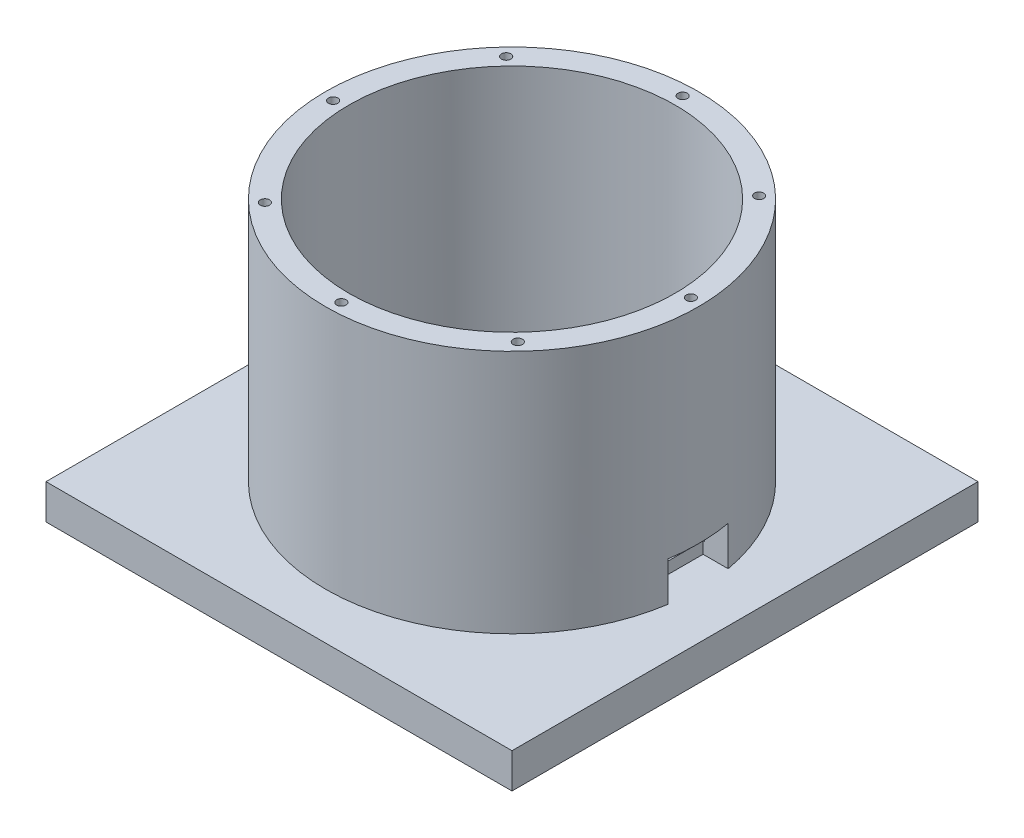
ISO-10303-21;
HEADER;
FILE_DESCRIPTION(('STEP AP214'),'2;1');
FILE_NAME('part.step','',(''),(''),'','','');
FILE_SCHEMA(('AUTOMOTIVE_DESIGN { 1 0 10303 214 1 1 1 1 }'));
ENDSEC;
DATA;
#1=APPLICATION_CONTEXT('core data for automotive mechanical design processes');
#2=APPLICATION_PROTOCOL_DEFINITION('international standard','automotive_design',2000,#1);
#3=PRODUCT_CONTEXT('',#1,'mechanical');
#4=PRODUCT('Part','Part','',(#3));
#5=PRODUCT_RELATED_PRODUCT_CATEGORY('part','',(#4));
#6=PRODUCT_DEFINITION_FORMATION('','',#4);
#7=PRODUCT_DEFINITION_CONTEXT('part definition',#1,'design');
#8=PRODUCT_DEFINITION('design','',#6,#7);
#9=PRODUCT_DEFINITION_SHAPE('','',#8);
#10=(LENGTH_UNIT() NAMED_UNIT(*) SI_UNIT(.MILLI.,.METRE.));
#11=(NAMED_UNIT(*) PLANE_ANGLE_UNIT() SI_UNIT($,.RADIAN.));
#12=(NAMED_UNIT(*) SI_UNIT($,.STERADIAN.) SOLID_ANGLE_UNIT());
#13=UNCERTAINTY_MEASURE_WITH_UNIT(LENGTH_MEASURE(1.E-05),#10,'distance_accuracy_value','');
#14=(GEOMETRIC_REPRESENTATION_CONTEXT(3) GLOBAL_UNCERTAINTY_ASSIGNED_CONTEXT((#13)) GLOBAL_UNIT_ASSIGNED_CONTEXT((#10,
#11,#12)) REPRESENTATION_CONTEXT('',''));
#15=CARTESIAN_POINT('',(0.,0.,0.));
#16=DIRECTION('',(0.,0.,1.));
#17=DIRECTION('',(1.,0.,0.));
#18=AXIS2_PLACEMENT_3D('',#15,#16,#17);
#19=CARTESIAN_POINT('',(0.,5.,0.));
#20=DIRECTION('',(0.,-1.,0.));
#21=DIRECTION('',(0.,0.,-1.));
#22=AXIS2_PLACEMENT_3D('',#19,#20,#21);
#23=CYLINDRICAL_SURFACE('',#22,80.);
#24=CARTESIAN_POINT('',(0.,0.,0.));
#25=DIRECTION('',(0.,1.,0.));
#26=DIRECTION('',(0.,0.,1.));
#27=AXIS2_PLACEMENT_3D('',#24,#25,#26);
#28=CIRCLE('',#27,80.);
#29=CARTESIAN_POINT('',(78.7649541216659,0.,-14.0029283441667));
#30=VERTEX_POINT('',#29);
#31=CARTESIAN_POINT('',(79.0659159763174,0.,12.18937778666));
#32=VERTEX_POINT('',#31);
#33=EDGE_CURVE('E244',#30,#32,#28,.T.);
#34=ORIENTED_EDGE('',*,*,#33,.T.);
#35=DIRECTION('',(0.,-1.,0.));
#36=VECTOR('',#35,1.);
#37=CARTESIAN_POINT('',(79.0659159763174,5.,12.18937778666));
#38=LINE('',#37,#36);
#39=CARTESIAN_POINT('',(79.0659159763174,16.9083896397272,12.18937778666));
#40=VERTEX_POINT('',#39);
#41=EDGE_CURVE('E158',#32,#40,#38,.F.);
#42=ORIENTED_EDGE('',*,*,#41,.T.);
#43=CARTESIAN_POINT('',(0.,16.9083896397272,0.));
#44=DIRECTION('',(0.,1.,0.));
#45=DIRECTION('',(0.,0.,1.));
#46=AXIS2_PLACEMENT_3D('',#43,#44,#45);
#47=CIRCLE('',#46,80.);
#48=CARTESIAN_POINT('',(78.7649541216659,16.9083896397272,-14.0029283441667));
#49=VERTEX_POINT('',#48);
#50=EDGE_CURVE('E198',#40,#49,#47,.T.);
#51=ORIENTED_EDGE('',*,*,#50,.T.);
#52=DIRECTION('',(0.,-1.,0.));
#53=VECTOR('',#52,1.);
#54=CARTESIAN_POINT('',(78.7649541216659,5.,-14.0029283441667));
#55=LINE('',#54,#53);
#56=EDGE_CURVE('E186',#49,#30,#55,.T.);
#57=ORIENTED_EDGE('',*,*,#56,.T.);
#58=EDGE_LOOP('',(#34,#42,#51,#57));
#59=FACE_BOUND('',#58,.T.);
#60=CARTESIAN_POINT('',(0.,105.,0.));
#61=DIRECTION('',(0.,1.,0.));
#62=DIRECTION('',(0.,0.,1.));
#63=AXIS2_PLACEMENT_3D('',#60,#61,#62);
#64=CIRCLE('',#63,80.);
#65=CARTESIAN_POINT('',(0.,105.,80.));
#66=VERTEX_POINT('',#65);
#67=EDGE_CURVE('E309',#66,#66,#64,.T.);
#68=ORIENTED_EDGE('',*,*,#67,.F.);
#69=EDGE_LOOP('',(#68));
#70=FACE_BOUND('',#69,.T.);
#71=ADVANCED_FACE('F45',(#59,#70),#23,.T.);
#72=CARTESIAN_POINT('',(0.,105.,0.));
#73=DIRECTION('',(0.,1.,0.));
#74=DIRECTION('',(0.,0.,1.));
#75=AXIS2_PLACEMENT_3D('',#72,#73,#74);
#76=PLANE('',#75);
#77=CARTESIAN_POINT('',(-75.,105.,1.76512337573966));
#78=DIRECTION('',(0.,1.,0.));
#79=DIRECTION('',(0.,0.,1.));
#80=AXIS2_PLACEMENT_3D('',#77,#78,#79);
#81=CIRCLE('',#80,2.);
#82=CARTESIAN_POINT('',(-75.,105.,3.76512337573966));
#83=VERTEX_POINT('',#82);
#84=EDGE_CURVE('E511',#83,#83,#81,.T.);
#85=ORIENTED_EDGE('',*,*,#84,.F.);
#86=EDGE_LOOP('',(#85));
#87=FACE_BOUND('',#86,.T.);
#88=CARTESIAN_POINT('',(75.,105.,-1.76512337574017));
#89=DIRECTION('',(0.,1.,0.));
#90=DIRECTION('',(0.,0.,1.));
#91=AXIS2_PLACEMENT_3D('',#88,#89,#90);
#92=CIRCLE('',#91,2.);
#93=CARTESIAN_POINT('',(75.,105.,0.234876624259833));
#94=VERTEX_POINT('',#93);
#95=EDGE_CURVE('E531',#94,#94,#92,.T.);
#96=ORIENTED_EDGE('',*,*,#95,.F.);
#97=EDGE_LOOP('',(#96));
#98=FACE_BOUND('',#97,.T.);
#99=CARTESIAN_POINT('',(-51.7848778803746,105.,54.2811392976076));
#100=DIRECTION('',(0.,1.,0.));
#101=DIRECTION('',(0.,0.,1.));
#102=AXIS2_PLACEMENT_3D('',#99,#100,#101);
#103=CIRCLE('',#102,2.00000000000001);
#104=CARTESIAN_POINT('',(-51.7848778803746,105.,56.2811392976076));
#105=VERTEX_POINT('',#104);
#106=EDGE_CURVE('E552',#105,#105,#103,.T.);
#107=ORIENTED_EDGE('',*,*,#106,.F.);
#108=EDGE_LOOP('',(#107));
#109=FACE_BOUND('',#108,.T.);
#110=CARTESIAN_POINT('',(-1.76512337574045,105.,-75.));
#111=DIRECTION('',(0.,1.,0.));
#112=DIRECTION('',(0.,0.,1.));
#113=AXIS2_PLACEMENT_3D('',#110,#111,#112);
#114=CIRCLE('',#113,2.);
#115=CARTESIAN_POINT('',(-1.76512337574045,105.,-73.));
#116=VERTEX_POINT('',#115);
#117=EDGE_CURVE('E543',#116,#116,#114,.T.);
#118=ORIENTED_EDGE('',*,*,#117,.F.);
#119=EDGE_LOOP('',(#118));
#120=FACE_BOUND('',#119,.T.);
#121=CARTESIAN_POINT('',(1.76512337573992,105.,75.));
#122=DIRECTION('',(0.,1.,0.));
#123=DIRECTION('',(0.,0.,1.));
#124=AXIS2_PLACEMENT_3D('',#121,#122,#123);
#125=CIRCLE('',#124,2.);
#126=CARTESIAN_POINT('',(1.76512337573992,105.,77.));
#127=VERTEX_POINT('',#126);
#128=EDGE_CURVE('E503',#127,#127,#125,.T.);
#129=ORIENTED_EDGE('',*,*,#128,.F.);
#130=EDGE_LOOP('',(#129));
#131=FACE_BOUND('',#130,.T.);
#132=CARTESIAN_POINT('',(54.2811392976078,105.,51.7848778803744));
#133=DIRECTION('',(0.,1.,0.));
#134=DIRECTION('',(0.,0.,1.));
#135=AXIS2_PLACEMENT_3D('',#132,#133,#134);
#136=CIRCLE('',#135,2.);
#137=CARTESIAN_POINT('',(54.2811392976078,105.,53.7848778803744));
#138=VERTEX_POINT('',#137);
#139=EDGE_CURVE('E513',#138,#138,#136,.T.);
#140=ORIENTED_EDGE('',*,*,#139,.F.);
#141=EDGE_LOOP('',(#140));
#142=FACE_BOUND('',#141,.T.);
#143=CARTESIAN_POINT('',(51.7848778803742,105.,-54.2811392976079));
#144=DIRECTION('',(0.,1.,0.));
#145=DIRECTION('',(0.,0.,1.));
#146=AXIS2_PLACEMENT_3D('',#143,#144,#145);
#147=CIRCLE('',#146,2.);
#148=CARTESIAN_POINT('',(51.7848778803742,105.,-52.2811392976079));
#149=VERTEX_POINT('',#148);
#150=EDGE_CURVE('E523',#149,#149,#147,.T.);
#151=ORIENTED_EDGE('',*,*,#150,.F.);
#152=EDGE_LOOP('',(#151));
#153=FACE_BOUND('',#152,.T.);
#154=CARTESIAN_POINT('',(-54.2811392976074,105.,-51.7848778803748));
#155=DIRECTION('',(0.,1.,0.));
#156=DIRECTION('',(0.,0.,1.));
#157=AXIS2_PLACEMENT_3D('',#154,#155,#156);
#158=CIRCLE('',#157,2.);
#159=CARTESIAN_POINT('',(-54.2811392976074,105.,-49.7848778803748));
#160=VERTEX_POINT('',#159);
#161=EDGE_CURVE('E547',#160,#160,#158,.T.);
#162=ORIENTED_EDGE('',*,*,#161,.F.);
#163=EDGE_LOOP('',(#162));
#164=FACE_BOUND('',#163,.T.);
#165=ORIENTED_EDGE('',*,*,#67,.T.);
#166=EDGE_LOOP('',(#165));
#167=FACE_BOUND('',#166,.T.);
#168=CARTESIAN_POINT('',(0.,105.,0.));
#169=DIRECTION('',(0.,1.,0.));
#170=DIRECTION('',(0.,0.,1.));
#171=AXIS2_PLACEMENT_3D('',#168,#169,#170);
#172=CIRCLE('',#171,70.);
#173=CARTESIAN_POINT('',(0.,105.,70.));
#174=VERTEX_POINT('',#173);
#175=EDGE_CURVE('E293',#174,#174,#172,.T.);
#176=ORIENTED_EDGE('',*,*,#175,.F.);
#177=EDGE_LOOP('',(#176));
#178=FACE_BOUND('',#177,.T.);
#179=ADVANCED_FACE('F357',(#87,#98,#109,#120,#131,#142,#153,#164,#167,#178),#76,.T.);
#180=CARTESIAN_POINT('',(0.,105.,0.));
#181=DIRECTION('',(0.,-1.,0.));
#182=DIRECTION('',(0.,0.,-1.));
#183=AXIS2_PLACEMENT_3D('',#180,#181,#182);
#184=CYLINDRICAL_SURFACE('',#183,70.);
#185=DIRECTION('',(0.,-1.,0.));
#186=VECTOR('',#185,1.);
#187=CARTESIAN_POINT('',(68.9305380014844,105.,12.18937778666));
#188=LINE('',#187,#186);
#189=CARTESIAN_POINT('',(68.9305380014844,5.,12.18937778666));
#190=VERTEX_POINT('',#189);
#191=CARTESIAN_POINT('',(68.9305380014844,16.9083896397272,12.18937778666));
#192=VERTEX_POINT('',#191);
#193=EDGE_CURVE('E193',#190,#192,#188,.F.);
#194=ORIENTED_EDGE('',*,*,#193,.F.);
#195=CARTESIAN_POINT('',(0.,5.,0.));
#196=DIRECTION('',(0.,1.,0.));
#197=DIRECTION('',(0.,0.,1.));
#198=AXIS2_PLACEMENT_3D('',#195,#196,#197);
#199=CIRCLE('',#198,70.);
#200=CARTESIAN_POINT('',(68.5851149870592,5.,-14.0029283441667));
#201=VERTEX_POINT('',#200);
#202=EDGE_CURVE('E313',#190,#201,#199,.F.);
#203=ORIENTED_EDGE('',*,*,#202,.T.);
#204=DIRECTION('',(0.,-1.,0.));
#205=VECTOR('',#204,1.);
#206=CARTESIAN_POINT('',(68.5851149870592,105.,-14.0029283441667));
#207=LINE('',#206,#205);
#208=CARTESIAN_POINT('',(68.5851149870592,16.9083896397272,-14.0029283441667));
#209=VERTEX_POINT('',#208);
#210=EDGE_CURVE('E183',#209,#201,#207,.T.);
#211=ORIENTED_EDGE('',*,*,#210,.F.);
#212=CARTESIAN_POINT('',(0.,16.9083896397272,0.));
#213=DIRECTION('',(0.,1.,0.));
#214=DIRECTION('',(0.,0.,1.));
#215=AXIS2_PLACEMENT_3D('',#212,#213,#214);
#216=CIRCLE('',#215,70.);
#217=EDGE_CURVE('E11',#192,#209,#216,.T.);
#218=ORIENTED_EDGE('',*,*,#217,.F.);
#219=EDGE_LOOP('',(#194,#203,#211,#218));
#220=FACE_BOUND('',#219,.T.);
#221=ORIENTED_EDGE('',*,*,#175,.T.);
#222=EDGE_LOOP('',(#221));
#223=FACE_BOUND('',#222,.T.);
#224=ADVANCED_FACE('F354',(#220,#223),#184,.F.);
#225=CARTESIAN_POINT('',(0.,5.,0.));
#226=DIRECTION('',(0.,1.,0.));
#227=DIRECTION('',(0.,0.,1.));
#228=AXIS2_PLACEMENT_3D('',#225,#226,#227);
#229=PLANE('',#228);
#230=DIRECTION('',(1.,0.,0.));
#231=VECTOR('',#230,1.);
#232=CARTESIAN_POINT('',(0.,5.,12.18937778666));
#233=LINE('',#232,#231);
#234=CARTESIAN_POINT('',(68.,5.,12.18937778666));
#235=VERTEX_POINT('',#234);
#236=EDGE_CURVE('E190',#235,#190,#233,.T.);
#237=ORIENTED_EDGE('',*,*,#236,.F.);
#238=DIRECTION('',(0.,0.,1.));
#239=VECTOR('',#238,1.);
#240=CARTESIAN_POINT('',(68.,5.,0.));
#241=LINE('',#240,#239);
#242=CARTESIAN_POINT('',(68.,5.,-14.0029283441667));
#243=VERTEX_POINT('',#242);
#244=EDGE_CURVE('E53',#243,#235,#241,.T.);
#245=ORIENTED_EDGE('',*,*,#244,.F.);
#246=DIRECTION('',(-1.,0.,0.));
#247=VECTOR('',#246,1.);
#248=CARTESIAN_POINT('',(0.,5.,-14.0029283441667));
#249=LINE('',#248,#247);
#250=EDGE_CURVE('E174',#201,#243,#249,.T.);
#251=ORIENTED_EDGE('',*,*,#250,.F.);
#252=ORIENTED_EDGE('',*,*,#202,.F.);
#253=EDGE_LOOP('',(#237,#245,#251,#252));
#254=FACE_BOUND('',#253,.T.);
#255=CARTESIAN_POINT('',(0.,5.,0.));
#256=DIRECTION('',(0.,1.,0.));
#257=DIRECTION('',(0.,0.,1.));
#258=AXIS2_PLACEMENT_3D('',#255,#256,#257);
#259=CIRCLE('',#258,16.15);
#260=CARTESIAN_POINT('',(0.,5.,16.15));
#261=VERTEX_POINT('',#260);
#262=EDGE_CURVE('E287',#261,#261,#259,.T.);
#263=ORIENTED_EDGE('',*,*,#262,.F.);
#264=EDGE_LOOP('',(#263));
#265=FACE_BOUND('',#264,.T.);
#266=CARTESIAN_POINT('',(40.,5.,0.));
#267=DIRECTION('',(0.,1.,0.));
#268=DIRECTION('',(0.,0.,1.));
#269=AXIS2_PLACEMENT_3D('',#266,#267,#268);
#270=CIRCLE('',#269,17.65);
#271=CARTESIAN_POINT('',(40.,5.,17.65));
#272=VERTEX_POINT('',#271);
#273=EDGE_CURVE('E297',#272,#272,#270,.T.);
#274=ORIENTED_EDGE('',*,*,#273,.F.);
#275=EDGE_LOOP('',(#274));
#276=FACE_BOUND('',#275,.T.);
#277=ADVANCED_FACE('F335',(#254,#265,#276),#229,.T.);
#278=CARTESIAN_POINT('',(40.,13.,0.));
#279=DIRECTION('',(0.,1.,0.));
#280=DIRECTION('',(0.,0.,1.));
#281=AXIS2_PLACEMENT_3D('',#278,#279,#280);
#282=PLANE('',#281);
#283=DIRECTION('',(-1.,0.,0.));
#284=VECTOR('',#283,1.);
#285=CARTESIAN_POINT('',(50.8117830414942,13.,6.56717956688094));
#286=LINE('',#285,#284);
#287=CARTESIAN_POINT('',(56.3827547297865,13.,6.56717956688094));
#288=VERTEX_POINT('',#287);
#289=CARTESIAN_POINT('',(50.8117830414942,13.,6.56717956688094));
#290=VERTEX_POINT('',#289);
#291=EDGE_CURVE('E250',#288,#290,#286,.T.);
#292=ORIENTED_EDGE('',*,*,#291,.F.);
#293=CARTESIAN_POINT('',(40.,13.,0.));
#294=DIRECTION('',(0.,1.,0.));
#295=DIRECTION('',(0.,0.,1.));
#296=AXIS2_PLACEMENT_3D('',#293,#294,#295);
#297=CIRCLE('',#296,17.65);
#298=CARTESIAN_POINT('',(56.008612694703,13.,-7.43282043311906));
#299=VERTEX_POINT('',#298);
#300=EDGE_CURVE('E282',#288,#299,#297,.T.);
#301=ORIENTED_EDGE('',*,*,#300,.T.);
#302=DIRECTION('',(1.,0.,0.));
#303=VECTOR('',#302,1.);
#304=CARTESIAN_POINT('',(50.2359992384236,13.,-7.43282043311906));
#305=LINE('',#304,#303);
#306=CARTESIAN_POINT('',(50.2359992384236,13.,-7.43282043311906));
#307=VERTEX_POINT('',#306);
#308=EDGE_CURVE('E260',#307,#299,#305,.T.);
#309=ORIENTED_EDGE('',*,*,#308,.F.);
#310=CARTESIAN_POINT('',(40.,13.,0.));
#311=DIRECTION('',(0.,1.,0.));
#312=DIRECTION('',(0.,0.,1.));
#313=AXIS2_PLACEMENT_3D('',#310,#311,#312);
#314=CIRCLE('',#313,12.65);
#315=EDGE_CURVE('E288',#290,#307,#314,.T.);
#316=ORIENTED_EDGE('',*,*,#315,.F.);
#317=EDGE_LOOP('',(#292,#301,#309,#316));
#318=FACE_BOUND('',#317,.T.);
#319=ADVANCED_FACE('F353',(#318),#282,.T.);
#320=CARTESIAN_POINT('',(40.,13.,0.));
#321=DIRECTION('',(0.,-1.,0.));
#322=DIRECTION('',(0.,0.,-1.));
#323=AXIS2_PLACEMENT_3D('',#320,#321,#322);
#324=CYLINDRICAL_SURFACE('',#323,17.65);
#325=ORIENTED_EDGE('',*,*,#300,.F.);
#326=DIRECTION('',(0.,-1.,0.));
#327=VECTOR('',#326,1.);
#328=CARTESIAN_POINT('',(56.3827547297865,63.,6.56717956688094));
#329=LINE('',#328,#327);
#330=CARTESIAN_POINT('',(56.3827547297865,63.,6.56717956688094));
#331=VERTEX_POINT('',#330);
#332=EDGE_CURVE('E270',#331,#288,#329,.T.);
#333=ORIENTED_EDGE('',*,*,#332,.F.);
#334=CARTESIAN_POINT('',(40.,63.,0.));
#335=DIRECTION('',(0.,1.,0.));
#336=DIRECTION('',(0.,0.,1.));
#337=AXIS2_PLACEMENT_3D('',#334,#335,#336);
#338=CIRCLE('',#337,17.65);
#339=CARTESIAN_POINT('',(56.008612694703,63.,-7.43282043311906));
#340=VERTEX_POINT('',#339);
#341=EDGE_CURVE('E253',#340,#331,#338,.T.);
#342=ORIENTED_EDGE('',*,*,#341,.F.);
#343=DIRECTION('',(0.,-1.,0.));
#344=VECTOR('',#343,1.);
#345=CARTESIAN_POINT('',(56.008612694703,63.,-7.43282043311906));
#346=LINE('',#345,#344);
#347=EDGE_CURVE('E274',#340,#299,#346,.T.);
#348=ORIENTED_EDGE('',*,*,#347,.T.);
#349=EDGE_LOOP('',(#325,#333,#342,#348));
#350=FACE_BOUND('',#349,.T.);
#351=ORIENTED_EDGE('',*,*,#273,.T.);
#352=EDGE_LOOP('',(#351));
#353=FACE_BOUND('',#352,.T.);
#354=ADVANCED_FACE('F379',(#350,#353),#324,.T.);
#355=CARTESIAN_POINT('',(40.,13.,0.));
#356=DIRECTION('',(0.,-1.,0.));
#357=DIRECTION('',(0.,0.,-1.));
#358=AXIS2_PLACEMENT_3D('',#355,#356,#357);
#359=CYLINDRICAL_SURFACE('',#358,12.65);
#360=ORIENTED_EDGE('',*,*,#315,.T.);
#361=DIRECTION('',(0.,-1.,0.));
#362=VECTOR('',#361,1.);
#363=CARTESIAN_POINT('',(50.2359992384236,63.,-7.43282043311906));
#364=LINE('',#363,#362);
#365=CARTESIAN_POINT('',(50.2359992384236,63.,-7.43282043311906));
#366=VERTEX_POINT('',#365);
#367=EDGE_CURVE('E278',#366,#307,#364,.T.);
#368=ORIENTED_EDGE('',*,*,#367,.F.);
#369=CARTESIAN_POINT('',(40.,63.,0.));
#370=DIRECTION('',(0.,-1.,0.));
#371=DIRECTION('',(0.,0.,1.));
#372=AXIS2_PLACEMENT_3D('',#369,#370,#371);
#373=CIRCLE('',#372,12.65);
#374=CARTESIAN_POINT('',(50.8117830414942,63.,6.56717956688094));
#375=VERTEX_POINT('',#374);
#376=EDGE_CURVE('E245',#375,#366,#373,.T.);
#377=ORIENTED_EDGE('',*,*,#376,.F.);
#378=DIRECTION('',(0.,-1.,0.));
#379=VECTOR('',#378,1.);
#380=CARTESIAN_POINT('',(50.8117830414942,63.,6.56717956688094));
#381=LINE('',#380,#379);
#382=EDGE_CURVE('E259',#375,#290,#381,.T.);
#383=ORIENTED_EDGE('',*,*,#382,.T.);
#384=EDGE_LOOP('',(#360,#368,#377,#383));
#385=FACE_BOUND('',#384,.T.);
#386=CARTESIAN_POINT('',(40.,5.,0.));
#387=DIRECTION('',(0.,1.,0.));
#388=DIRECTION('',(0.,0.,1.));
#389=AXIS2_PLACEMENT_3D('',#386,#387,#388);
#390=CIRCLE('',#389,12.65);
#391=CARTESIAN_POINT('',(40.,5.,12.65));
#392=VERTEX_POINT('',#391);
#393=EDGE_CURVE('E319',#392,#392,#390,.F.);
#394=ORIENTED_EDGE('',*,*,#393,.T.);
#395=EDGE_LOOP('',(#394));
#396=FACE_BOUND('',#395,.T.);
#397=ADVANCED_FACE('F350',(#385,#396),#359,.F.);
#398=ORIENTED_EDGE('',*,*,#393,.F.);
#399=EDGE_LOOP('',(#398));
#400=FACE_BOUND('',#399,.T.);
#401=ADVANCED_FACE('F334',(#400),#229,.T.);
#402=CARTESIAN_POINT('',(0.,13.,0.));
#403=DIRECTION('',(0.,1.,0.));
#404=DIRECTION('',(0.,0.,1.));
#405=AXIS2_PLACEMENT_3D('',#402,#403,#404);
#406=PLANE('',#405);
#407=CARTESIAN_POINT('',(0.,13.,0.));
#408=DIRECTION('',(0.,1.,0.));
#409=DIRECTION('',(0.,0.,1.));
#410=AXIS2_PLACEMENT_3D('',#407,#408,#409);
#411=CIRCLE('',#410,16.15);
#412=CARTESIAN_POINT('',(0.,13.,16.15));
#413=VERTEX_POINT('',#412);
#414=EDGE_CURVE('E289',#413,#413,#411,.T.);
#415=ORIENTED_EDGE('',*,*,#414,.T.);
#416=EDGE_LOOP('',(#415));
#417=FACE_BOUND('',#416,.T.);
#418=CARTESIAN_POINT('',(0.,13.,0.));
#419=DIRECTION('',(0.,1.,0.));
#420=DIRECTION('',(0.,0.,1.));
#421=AXIS2_PLACEMENT_3D('',#418,#419,#420);
#422=CIRCLE('',#421,12.15);
#423=CARTESIAN_POINT('',(0.,13.,12.15));
#424=VERTEX_POINT('',#423);
#425=EDGE_CURVE('E283',#424,#424,#422,.T.);
#426=ORIENTED_EDGE('',*,*,#425,.F.);
#427=EDGE_LOOP('',(#426));
#428=FACE_BOUND('',#427,.T.);
#429=ADVANCED_FACE('F349',(#417,#428),#406,.T.);
#430=CARTESIAN_POINT('',(0.,13.,0.));
#431=DIRECTION('',(0.,-1.,0.));
#432=DIRECTION('',(0.,0.,-1.));
#433=AXIS2_PLACEMENT_3D('',#430,#431,#432);
#434=CYLINDRICAL_SURFACE('',#433,16.15);
#435=ORIENTED_EDGE('',*,*,#414,.F.);
#436=EDGE_LOOP('',(#435));
#437=FACE_BOUND('',#436,.T.);
#438=ORIENTED_EDGE('',*,*,#262,.T.);
#439=EDGE_LOOP('',(#438));
#440=FACE_BOUND('',#439,.T.);
#441=ADVANCED_FACE('F344',(#437,#440),#434,.T.);
#442=CARTESIAN_POINT('',(0.,13.,0.));
#443=DIRECTION('',(0.,-1.,0.));
#444=DIRECTION('',(0.,0.,-1.));
#445=AXIS2_PLACEMENT_3D('',#442,#443,#444);
#446=CYLINDRICAL_SURFACE('',#445,12.15);
#447=ORIENTED_EDGE('',*,*,#425,.T.);
#448=EDGE_LOOP('',(#447));
#449=FACE_BOUND('',#448,.T.);
#450=CARTESIAN_POINT('',(0.,5.,0.));
#451=DIRECTION('',(0.,1.,0.));
#452=DIRECTION('',(0.,0.,1.));
#453=AXIS2_PLACEMENT_3D('',#450,#451,#452);
#454=CIRCLE('',#453,12.15);
#455=CARTESIAN_POINT('',(0.,5.,12.15));
#456=VERTEX_POINT('',#455);
#457=EDGE_CURVE('E323',#456,#456,#454,.F.);
#458=ORIENTED_EDGE('',*,*,#457,.T.);
#459=EDGE_LOOP('',(#458));
#460=FACE_BOUND('',#459,.T.);
#461=ADVANCED_FACE('F329',(#449,#460),#446,.F.);
#462=ORIENTED_EDGE('',*,*,#457,.F.);
#463=EDGE_LOOP('',(#462));
#464=FACE_BOUND('',#463,.T.);
#465=ADVANCED_FACE('F331',(#464),#229,.T.);
#466=CARTESIAN_POINT('',(50.2359992384236,63.,-7.43282043311906));
#467=DIRECTION('',(0.,0.,-1.));
#468=DIRECTION('',(-1.,0.,0.));
#469=AXIS2_PLACEMENT_3D('',#466,#467,#468);
#470=PLANE('',#469);
#471=ORIENTED_EDGE('',*,*,#308,.T.);
#472=ORIENTED_EDGE('',*,*,#347,.F.);
#473=DIRECTION('',(1.,0.,0.));
#474=VECTOR('',#473,1.);
#475=CARTESIAN_POINT('',(50.2359992384236,63.,-7.43282043311906));
#476=LINE('',#475,#474);
#477=EDGE_CURVE('E249',#366,#340,#476,.T.);
#478=ORIENTED_EDGE('',*,*,#477,.F.);
#479=ORIENTED_EDGE('',*,*,#367,.T.);
#480=EDGE_LOOP('',(#471,#472,#478,#479));
#481=FACE_BOUND('',#480,.T.);
#482=ADVANCED_FACE('F333',(#481),#470,.F.);
#483=CARTESIAN_POINT('',(50.8117830414942,63.,6.56717956688094));
#484=DIRECTION('',(0.,0.,1.));
#485=DIRECTION('',(1.,0.,0.));
#486=AXIS2_PLACEMENT_3D('',#483,#484,#485);
#487=PLANE('',#486);
#488=ORIENTED_EDGE('',*,*,#291,.T.);
#489=ORIENTED_EDGE('',*,*,#382,.F.);
#490=DIRECTION('',(-1.,0.,0.));
#491=VECTOR('',#490,1.);
#492=CARTESIAN_POINT('',(50.8117830414942,63.,6.56717956688094));
#493=LINE('',#492,#491);
#494=EDGE_CURVE('E256',#331,#375,#493,.T.);
#495=ORIENTED_EDGE('',*,*,#494,.F.);
#496=ORIENTED_EDGE('',*,*,#332,.T.);
#497=EDGE_LOOP('',(#488,#489,#495,#496));
#498=FACE_BOUND('',#497,.T.);
#499=ADVANCED_FACE('F341',(#498),#487,.F.);
#500=CARTESIAN_POINT('',(40.,63.,0.));
#501=DIRECTION('',(0.,1.,0.));
#502=DIRECTION('',(0.,0.,1.));
#503=AXIS2_PLACEMENT_3D('',#500,#501,#502);
#504=PLANE('',#503);
#505=ORIENTED_EDGE('',*,*,#376,.T.);
#506=ORIENTED_EDGE('',*,*,#477,.T.);
#507=ORIENTED_EDGE('',*,*,#341,.T.);
#508=ORIENTED_EDGE('',*,*,#494,.T.);
#509=EDGE_LOOP('',(#505,#506,#507,#508));
#510=FACE_BOUND('',#509,.T.);
#511=ADVANCED_FACE('F394',(#510),#504,.T.);
#512=CARTESIAN_POINT('',(-100.,-15.,100.));
#513=DIRECTION('',(1.,0.,0.));
#514=DIRECTION('',(0.,0.,-1.));
#515=AXIS2_PLACEMENT_3D('',#512,#513,#514);
#516=PLANE('',#515);
#517=DIRECTION('',(0.,0.,-1.));
#518=VECTOR('',#517,1.);
#519=CARTESIAN_POINT('',(-100.,0.,100.));
#520=LINE('',#519,#518);
#521=CARTESIAN_POINT('',(-100.,0.,100.));
#522=VERTEX_POINT('',#521);
#523=CARTESIAN_POINT('',(-100.,0.,-100.));
#524=VERTEX_POINT('',#523);
#525=EDGE_CURVE('E202',#522,#524,#520,.T.);
#526=ORIENTED_EDGE('',*,*,#525,.T.);
#527=DIRECTION('',(0.,1.,0.));
#528=VECTOR('',#527,1.);
#529=CARTESIAN_POINT('',(-100.,-15.,-100.));
#530=LINE('',#529,#528);
#531=CARTESIAN_POINT('',(-100.,-15.,-100.));
#532=VERTEX_POINT('',#531);
#533=EDGE_CURVE('E240',#532,#524,#530,.T.);
#534=ORIENTED_EDGE('',*,*,#533,.F.);
#535=DIRECTION('',(0.,0.,-1.));
#536=VECTOR('',#535,1.);
#537=CARTESIAN_POINT('',(-100.,-15.,100.));
#538=LINE('',#537,#536);
#539=CARTESIAN_POINT('',(-100.,-15.,100.));
#540=VERTEX_POINT('',#539);
#541=EDGE_CURVE('E203',#540,#532,#538,.T.);
#542=ORIENTED_EDGE('',*,*,#541,.F.);
#543=DIRECTION('',(0.,1.,0.));
#544=VECTOR('',#543,1.);
#545=CARTESIAN_POINT('',(-100.,-15.,100.));
#546=LINE('',#545,#544);
#547=EDGE_CURVE('E217',#540,#522,#546,.T.);
#548=ORIENTED_EDGE('',*,*,#547,.T.);
#549=EDGE_LOOP('',(#526,#534,#542,#548));
#550=FACE_BOUND('',#549,.T.);
#551=ADVANCED_FACE('F398',(#550),#516,.F.);
#552=CARTESIAN_POINT('',(-100.,-15.,-100.));
#553=DIRECTION('',(0.,0.,1.));
#554=DIRECTION('',(1.,0.,0.));
#555=AXIS2_PLACEMENT_3D('',#552,#553,#554);
#556=PLANE('',#555);
#557=DIRECTION('',(1.,0.,0.));
#558=VECTOR('',#557,1.);
#559=CARTESIAN_POINT('',(-100.,0.,-100.));
#560=LINE('',#559,#558);
#561=CARTESIAN_POINT('',(100.,0.,-100.));
#562=VERTEX_POINT('',#561);
#563=EDGE_CURVE('E221',#524,#562,#560,.T.);
#564=ORIENTED_EDGE('',*,*,#563,.T.);
#565=DIRECTION('',(0.,1.,0.));
#566=VECTOR('',#565,1.);
#567=CARTESIAN_POINT('',(100.,-15.,-100.));
#568=LINE('',#567,#566);
#569=CARTESIAN_POINT('',(100.,-15.,-100.));
#570=VERTEX_POINT('',#569);
#571=EDGE_CURVE('E236',#570,#562,#568,.T.);
#572=ORIENTED_EDGE('',*,*,#571,.F.);
#573=DIRECTION('',(1.,0.,0.));
#574=VECTOR('',#573,1.);
#575=CARTESIAN_POINT('',(-100.,-15.,-100.));
#576=LINE('',#575,#574);
#577=EDGE_CURVE('E207',#532,#570,#576,.T.);
#578=ORIENTED_EDGE('',*,*,#577,.F.);
#579=ORIENTED_EDGE('',*,*,#533,.T.);
#580=EDGE_LOOP('',(#564,#572,#578,#579));
#581=FACE_BOUND('',#580,.T.);
#582=ADVANCED_FACE('F402',(#581),#556,.F.);
#583=CARTESIAN_POINT('',(100.,-15.,100.));
#584=DIRECTION('',(-1.,0.,0.));
#585=DIRECTION('',(0.,0.,1.));
#586=AXIS2_PLACEMENT_3D('',#583,#584,#585);
#587=PLANE('',#586);
#588=DIRECTION('',(0.,0.,1.));
#589=VECTOR('',#588,1.);
#590=CARTESIAN_POINT('',(100.,0.,100.));
#591=LINE('',#590,#589);
#592=CARTESIAN_POINT('',(100.,0.,100.));
#593=VERTEX_POINT('',#592);
#594=EDGE_CURVE('E224',#562,#593,#591,.T.);
#595=ORIENTED_EDGE('',*,*,#594,.T.);
#596=DIRECTION('',(0.,1.,0.));
#597=VECTOR('',#596,1.);
#598=CARTESIAN_POINT('',(100.,-15.,100.));
#599=LINE('',#598,#597);
#600=CARTESIAN_POINT('',(100.,-15.,100.));
#601=VERTEX_POINT('',#600);
#602=EDGE_CURVE('E232',#601,#593,#599,.T.);
#603=ORIENTED_EDGE('',*,*,#602,.F.);
#604=DIRECTION('',(0.,0.,1.));
#605=VECTOR('',#604,1.);
#606=CARTESIAN_POINT('',(100.,-15.,100.));
#607=LINE('',#606,#605);
#608=EDGE_CURVE('E211',#570,#601,#607,.T.);
#609=ORIENTED_EDGE('',*,*,#608,.F.);
#610=ORIENTED_EDGE('',*,*,#571,.T.);
#611=EDGE_LOOP('',(#595,#603,#609,#610));
#612=FACE_BOUND('',#611,.T.);
#613=ADVANCED_FACE('F406',(#612),#587,.F.);
#614=CARTESIAN_POINT('',(-100.,-15.,100.));
#615=DIRECTION('',(0.,0.,-1.));
#616=DIRECTION('',(-1.,0.,0.));
#617=AXIS2_PLACEMENT_3D('',#614,#615,#616);
#618=PLANE('',#617);
#619=DIRECTION('',(-1.,0.,0.));
#620=VECTOR('',#619,1.);
#621=CARTESIAN_POINT('',(-100.,0.,100.));
#622=LINE('',#621,#620);
#623=EDGE_CURVE('E208',#593,#522,#622,.T.);
#624=ORIENTED_EDGE('',*,*,#623,.T.);
#625=ORIENTED_EDGE('',*,*,#547,.F.);
#626=DIRECTION('',(-1.,0.,0.));
#627=VECTOR('',#626,1.);
#628=CARTESIAN_POINT('',(-100.,-15.,100.));
#629=LINE('',#628,#627);
#630=EDGE_CURVE('E214',#601,#540,#629,.T.);
#631=ORIENTED_EDGE('',*,*,#630,.F.);
#632=ORIENTED_EDGE('',*,*,#602,.T.);
#633=EDGE_LOOP('',(#624,#625,#631,#632));
#634=FACE_BOUND('',#633,.T.);
#635=ADVANCED_FACE('F410',(#634),#618,.F.);
#636=CARTESIAN_POINT('',(0.,-15.,0.));
#637=DIRECTION('',(0.,-1.,0.));
#638=DIRECTION('',(0.,0.,-1.));
#639=AXIS2_PLACEMENT_3D('',#636,#637,#638);
#640=PLANE('',#639);
#641=ORIENTED_EDGE('',*,*,#541,.T.);
#642=ORIENTED_EDGE('',*,*,#577,.T.);
#643=ORIENTED_EDGE('',*,*,#608,.T.);
#644=ORIENTED_EDGE('',*,*,#630,.T.);
#645=EDGE_LOOP('',(#641,#642,#643,#644));
#646=FACE_BOUND('',#645,.T.);
#647=ADVANCED_FACE('F414',(#646),#640,.T.);
#648=CARTESIAN_POINT('',(0.,0.,0.));
#649=DIRECTION('',(0.,-1.,0.));
#650=DIRECTION('',(0.,0.,-1.));
#651=AXIS2_PLACEMENT_3D('',#648,#649,#650);
#652=PLANE('',#651);
#653=ORIENTED_EDGE('',*,*,#33,.F.);
#654=DIRECTION('',(1.,0.,0.));
#655=VECTOR('',#654,1.);
#656=CARTESIAN_POINT('',(68.,0.,-14.0029283441667));
#657=LINE('',#656,#655);
#658=CARTESIAN_POINT('',(68.,0.,-14.0029283441667));
#659=VERTEX_POINT('',#658);
#660=EDGE_CURVE('E161',#659,#30,#657,.T.);
#661=ORIENTED_EDGE('',*,*,#660,.F.);
#662=DIRECTION('',(0.,0.,-1.));
#663=VECTOR('',#662,1.);
#664=CARTESIAN_POINT('',(68.,0.,12.18937778666));
#665=LINE('',#664,#663);
#666=CARTESIAN_POINT('',(68.,0.,12.18937778666));
#667=VERTEX_POINT('',#666);
#668=EDGE_CURVE('E148',#667,#659,#665,.T.);
#669=ORIENTED_EDGE('',*,*,#668,.F.);
#670=DIRECTION('',(1.,0.,0.));
#671=VECTOR('',#670,1.);
#672=CARTESIAN_POINT('',(68.,0.,12.18937778666));
#673=LINE('',#672,#671);
#674=EDGE_CURVE('E68',#667,#32,#673,.T.);
#675=ORIENTED_EDGE('',*,*,#674,.T.);
#676=EDGE_LOOP('',(#653,#661,#669,#675));
#677=FACE_BOUND('',#676,.T.);
#678=ORIENTED_EDGE('',*,*,#623,.F.);
#679=ORIENTED_EDGE('',*,*,#594,.F.);
#680=ORIENTED_EDGE('',*,*,#563,.F.);
#681=ORIENTED_EDGE('',*,*,#525,.F.);
#682=EDGE_LOOP('',(#678,#679,#680,#681));
#683=FACE_BOUND('',#682,.T.);
#684=ADVANCED_FACE('F163',(#677,#683),#652,.F.);
#685=CARTESIAN_POINT('',(68.,16.9083896397272,12.18937778666));
#686=DIRECTION('',(0.,1.,0.));
#687=DIRECTION('',(0.,0.,1.));
#688=AXIS2_PLACEMENT_3D('',#685,#686,#687);
#689=PLANE('',#688);
#690=DIRECTION('',(1.,0.,0.));
#691=VECTOR('',#690,1.);
#692=CARTESIAN_POINT('',(68.,16.9083896397272,12.18937778666));
#693=LINE('',#692,#691);
#694=EDGE_CURVE('E171',#192,#40,#693,.T.);
#695=ORIENTED_EDGE('',*,*,#694,.F.);
#696=ORIENTED_EDGE('',*,*,#217,.T.);
#697=DIRECTION('',(1.,0.,0.));
#698=VECTOR('',#697,1.);
#699=CARTESIAN_POINT('',(68.,16.9083896397272,-14.0029283441667));
#700=LINE('',#699,#698);
#701=EDGE_CURVE('E175',#209,#49,#700,.T.);
#702=ORIENTED_EDGE('',*,*,#701,.T.);
#703=ORIENTED_EDGE('',*,*,#50,.F.);
#704=EDGE_LOOP('',(#695,#696,#702,#703));
#705=FACE_BOUND('',#704,.T.);
#706=ADVANCED_FACE('F418',(#705),#689,.F.);
#707=CARTESIAN_POINT('',(68.,0.,12.18937778666));
#708=DIRECTION('',(0.,0.,1.));
#709=DIRECTION('',(1.,0.,0.));
#710=AXIS2_PLACEMENT_3D('',#707,#708,#709);
#711=PLANE('',#710);
#712=ORIENTED_EDGE('',*,*,#674,.F.);
#713=DIRECTION('',(0.,-1.,0.));
#714=VECTOR('',#713,1.);
#715=CARTESIAN_POINT('',(68.,0.,12.18937778666));
#716=LINE('',#715,#714);
#717=EDGE_CURVE('E146',#235,#667,#716,.T.);
#718=ORIENTED_EDGE('',*,*,#717,.F.);
#719=ORIENTED_EDGE('',*,*,#236,.T.);
#720=ORIENTED_EDGE('',*,*,#193,.T.);
#721=ORIENTED_EDGE('',*,*,#694,.T.);
#722=ORIENTED_EDGE('',*,*,#41,.F.);
#723=EDGE_LOOP('',(#712,#718,#719,#720,#721,#722));
#724=FACE_BOUND('',#723,.T.);
#725=ADVANCED_FACE('F155',(#724),#711,.F.);
#726=CARTESIAN_POINT('',(68.,0.,-14.0029283441667));
#727=DIRECTION('',(0.,0.,-1.));
#728=DIRECTION('',(-1.,0.,0.));
#729=AXIS2_PLACEMENT_3D('',#726,#727,#728);
#730=PLANE('',#729);
#731=ORIENTED_EDGE('',*,*,#701,.F.);
#732=ORIENTED_EDGE('',*,*,#210,.T.);
#733=ORIENTED_EDGE('',*,*,#250,.T.);
#734=DIRECTION('',(0.,1.,0.));
#735=VECTOR('',#734,1.);
#736=CARTESIAN_POINT('',(68.,0.,-14.0029283441667));
#737=LINE('',#736,#735);
#738=EDGE_CURVE('E60',#659,#243,#737,.T.);
#739=ORIENTED_EDGE('',*,*,#738,.F.);
#740=ORIENTED_EDGE('',*,*,#660,.T.);
#741=ORIENTED_EDGE('',*,*,#56,.F.);
#742=EDGE_LOOP('',(#731,#732,#733,#739,#740,#741));
#743=FACE_BOUND('',#742,.T.);
#744=ADVANCED_FACE('F423',(#743),#730,.F.);
#745=CARTESIAN_POINT('',(68.,0.,0.));
#746=DIRECTION('',(-1.,0.,0.));
#747=DIRECTION('',(0.,0.,1.));
#748=AXIS2_PLACEMENT_3D('',#745,#746,#747);
#749=PLANE('',#748);
#750=ORIENTED_EDGE('',*,*,#244,.T.);
#751=ORIENTED_EDGE('',*,*,#717,.T.);
#752=ORIENTED_EDGE('',*,*,#668,.T.);
#753=ORIENTED_EDGE('',*,*,#738,.T.);
#754=EDGE_LOOP('',(#750,#751,#752,#753));
#755=FACE_BOUND('',#754,.T.);
#756=ADVANCED_FACE('F147',(#755),#749,.F.);
#757=CARTESIAN_POINT('',(-54.2811392976074,95.,-51.7848778803748));
#758=DIRECTION('',(0.,1.,0.));
#759=DIRECTION('',(0.,0.,1.));
#760=AXIS2_PLACEMENT_3D('',#757,#758,#759);
#761=CYLINDRICAL_SURFACE('',#760,2.);
#762=CARTESIAN_POINT('',(-54.2811392976074,95.,-51.7848778803748));
#763=DIRECTION('',(0.,1.,0.));
#764=DIRECTION('',(0.,0.,1.));
#765=AXIS2_PLACEMENT_3D('',#762,#763,#764);
#766=CIRCLE('',#765,2.);
#767=CARTESIAN_POINT('',(-54.2811392976074,95.,-49.7848778803748));
#768=VERTEX_POINT('',#767);
#769=EDGE_CURVE('E153',#768,#768,#766,.T.);
#770=ORIENTED_EDGE('',*,*,#769,.F.);
#771=EDGE_LOOP('',(#770));
#772=FACE_BOUND('',#771,.T.);
#773=ORIENTED_EDGE('',*,*,#161,.T.);
#774=EDGE_LOOP('',(#773));
#775=FACE_BOUND('',#774,.T.);
#776=ADVANCED_FACE('F432',(#772,#775),#761,.F.);
#777=CARTESIAN_POINT('',(0.,95.,0.));
#778=DIRECTION('',(0.,1.,0.));
#779=DIRECTION('',(0.,0.,1.));
#780=AXIS2_PLACEMENT_3D('',#777,#778,#779);
#781=PLANE('',#780);
#782=ORIENTED_EDGE('',*,*,#769,.T.);
#783=EDGE_LOOP('',(#782));
#784=FACE_BOUND('',#783,.T.);
#785=ADVANCED_FACE('F435',(#784),#781,.T.);
#786=CARTESIAN_POINT('',(51.7848778803742,95.,-54.2811392976079));
#787=DIRECTION('',(0.,1.,0.));
#788=DIRECTION('',(0.,0.,1.));
#789=AXIS2_PLACEMENT_3D('',#786,#787,#788);
#790=CYLINDRICAL_SURFACE('',#789,2.);
#791=CARTESIAN_POINT('',(51.7848778803742,95.,-54.2811392976079));
#792=DIRECTION('',(0.,1.,0.));
#793=DIRECTION('',(0.,0.,1.));
#794=AXIS2_PLACEMENT_3D('',#791,#792,#793);
#795=CIRCLE('',#794,2.);
#796=CARTESIAN_POINT('',(51.7848778803742,95.,-52.2811392976079));
#797=VERTEX_POINT('',#796);
#798=EDGE_CURVE('E527',#797,#797,#795,.T.);
#799=ORIENTED_EDGE('',*,*,#798,.F.);
#800=EDGE_LOOP('',(#799));
#801=FACE_BOUND('',#800,.T.);
#802=ORIENTED_EDGE('',*,*,#150,.T.);
#803=EDGE_LOOP('',(#802));
#804=FACE_BOUND('',#803,.T.);
#805=ADVANCED_FACE('F439',(#801,#804),#790,.F.);
#806=CARTESIAN_POINT('',(51.7848778803742,95.,-54.2811392976079));
#807=DIRECTION('',(0.,1.,0.));
#808=DIRECTION('',(0.,0.,1.));
#809=AXIS2_PLACEMENT_3D('',#806,#807,#808);
#810=PLANE('',#809);
#811=ORIENTED_EDGE('',*,*,#798,.T.);
#812=EDGE_LOOP('',(#811));
#813=FACE_BOUND('',#812,.T.);
#814=ADVANCED_FACE('F474',(#813),#810,.T.);
#815=CARTESIAN_POINT('',(54.2811392976078,95.,51.7848778803744));
#816=DIRECTION('',(0.,1.,0.));
#817=DIRECTION('',(0.,0.,1.));
#818=AXIS2_PLACEMENT_3D('',#815,#816,#817);
#819=CYLINDRICAL_SURFACE('',#818,2.);
#820=CARTESIAN_POINT('',(54.2811392976078,95.,51.7848778803744));
#821=DIRECTION('',(0.,1.,0.));
#822=DIRECTION('',(0.,0.,1.));
#823=AXIS2_PLACEMENT_3D('',#820,#821,#822);
#824=CIRCLE('',#823,2.);
#825=CARTESIAN_POINT('',(54.2811392976078,95.,53.7848778803744));
#826=VERTEX_POINT('',#825);
#827=EDGE_CURVE('E519',#826,#826,#824,.T.);
#828=ORIENTED_EDGE('',*,*,#827,.F.);
#829=EDGE_LOOP('',(#828));
#830=FACE_BOUND('',#829,.T.);
#831=ORIENTED_EDGE('',*,*,#139,.T.);
#832=EDGE_LOOP('',(#831));
#833=FACE_BOUND('',#832,.T.);
#834=ADVANCED_FACE('F477',(#830,#833),#819,.F.);
#835=CARTESIAN_POINT('',(54.2811392976078,95.,51.7848778803744));
#836=DIRECTION('',(0.,1.,0.));
#837=DIRECTION('',(0.,0.,1.));
#838=AXIS2_PLACEMENT_3D('',#835,#836,#837);
#839=PLANE('',#838);
#840=ORIENTED_EDGE('',*,*,#827,.T.);
#841=EDGE_LOOP('',(#840));
#842=FACE_BOUND('',#841,.T.);
#843=ADVANCED_FACE('F482',(#842),#839,.T.);
#844=CARTESIAN_POINT('',(1.76512337573992,95.,75.));
#845=DIRECTION('',(0.,1.,0.));
#846=DIRECTION('',(0.,0.,1.));
#847=AXIS2_PLACEMENT_3D('',#844,#845,#846);
#848=CYLINDRICAL_SURFACE('',#847,2.);
#849=CARTESIAN_POINT('',(1.76512337573992,95.,75.));
#850=DIRECTION('',(0.,1.,0.));
#851=DIRECTION('',(0.,0.,1.));
#852=AXIS2_PLACEMENT_3D('',#849,#850,#851);
#853=CIRCLE('',#852,2.);
#854=CARTESIAN_POINT('',(1.76512337573992,95.,77.));
#855=VERTEX_POINT('',#854);
#856=EDGE_CURVE('E500',#855,#855,#853,.T.);
#857=ORIENTED_EDGE('',*,*,#856,.F.);
#858=EDGE_LOOP('',(#857));
#859=FACE_BOUND('',#858,.T.);
#860=ORIENTED_EDGE('',*,*,#128,.T.);
#861=EDGE_LOOP('',(#860));
#862=FACE_BOUND('',#861,.T.);
#863=ADVANCED_FACE('F485',(#859,#862),#848,.F.);
#864=CARTESIAN_POINT('',(1.76512337573992,95.,75.));
#865=DIRECTION('',(0.,1.,0.));
#866=DIRECTION('',(0.,0.,1.));
#867=AXIS2_PLACEMENT_3D('',#864,#865,#866);
#868=PLANE('',#867);
#869=ORIENTED_EDGE('',*,*,#856,.T.);
#870=EDGE_LOOP('',(#869));
#871=FACE_BOUND('',#870,.T.);
#872=ADVANCED_FACE('F457',(#871),#868,.T.);
#873=CARTESIAN_POINT('',(-1.76512337574045,95.,-75.));
#874=DIRECTION('',(0.,1.,0.));
#875=DIRECTION('',(0.,0.,1.));
#876=AXIS2_PLACEMENT_3D('',#873,#874,#875);
#877=CYLINDRICAL_SURFACE('',#876,2.);
#878=CARTESIAN_POINT('',(-1.76512337574045,95.,-75.));
#879=DIRECTION('',(0.,1.,0.));
#880=DIRECTION('',(0.,0.,1.));
#881=AXIS2_PLACEMENT_3D('',#878,#879,#880);
#882=CIRCLE('',#881,2.);
#883=CARTESIAN_POINT('',(-1.76512337574045,95.,-73.));
#884=VERTEX_POINT('',#883);
#885=EDGE_CURVE('E548',#884,#884,#882,.T.);
#886=ORIENTED_EDGE('',*,*,#885,.F.);
#887=EDGE_LOOP('',(#886));
#888=FACE_BOUND('',#887,.T.);
#889=ORIENTED_EDGE('',*,*,#117,.T.);
#890=EDGE_LOOP('',(#889));
#891=FACE_BOUND('',#890,.T.);
#892=ADVANCED_FACE('F453',(#888,#891),#877,.F.);
#893=CARTESIAN_POINT('',(0.,95.,0.));
#894=DIRECTION('',(0.,1.,0.));
#895=DIRECTION('',(0.,0.,1.));
#896=AXIS2_PLACEMENT_3D('',#893,#894,#895);
#897=PLANE('',#896);
#898=ORIENTED_EDGE('',*,*,#885,.T.);
#899=EDGE_LOOP('',(#898));
#900=FACE_BOUND('',#899,.T.);
#901=ADVANCED_FACE('F449',(#900),#897,.T.);
#902=CARTESIAN_POINT('',(-51.7848778803746,95.,54.2811392976076));
#903=DIRECTION('',(0.,1.,0.));
#904=DIRECTION('',(0.,0.,1.));
#905=AXIS2_PLACEMENT_3D('',#902,#903,#904);
#906=CYLINDRICAL_SURFACE('',#905,2.00000000000001);
#907=CARTESIAN_POINT('',(-51.7848778803746,95.,54.2811392976076));
#908=DIRECTION('',(0.,1.,0.));
#909=DIRECTION('',(0.,0.,1.));
#910=AXIS2_PLACEMENT_3D('',#907,#908,#909);
#911=CIRCLE('',#910,2.00000000000001);
#912=CARTESIAN_POINT('',(-51.7848778803746,95.,56.2811392976076));
#913=VERTEX_POINT('',#912);
#914=EDGE_CURVE('E535',#913,#913,#911,.T.);
#915=ORIENTED_EDGE('',*,*,#914,.F.);
#916=EDGE_LOOP('',(#915));
#917=FACE_BOUND('',#916,.T.);
#918=ORIENTED_EDGE('',*,*,#106,.T.);
#919=EDGE_LOOP('',(#918));
#920=FACE_BOUND('',#919,.T.);
#921=ADVANCED_FACE('F445',(#917,#920),#906,.F.);
#922=CARTESIAN_POINT('',(0.,95.,0.));
#923=DIRECTION('',(0.,1.,0.));
#924=DIRECTION('',(0.,0.,1.));
#925=AXIS2_PLACEMENT_3D('',#922,#923,#924);
#926=PLANE('',#925);
#927=ORIENTED_EDGE('',*,*,#914,.T.);
#928=EDGE_LOOP('',(#927));
#929=FACE_BOUND('',#928,.T.);
#930=ADVANCED_FACE('F441',(#929),#926,.T.);
#931=CARTESIAN_POINT('',(75.,95.,-1.76512337574017));
#932=DIRECTION('',(0.,1.,0.));
#933=DIRECTION('',(0.,0.,1.));
#934=AXIS2_PLACEMENT_3D('',#931,#932,#933);
#935=CYLINDRICAL_SURFACE('',#934,2.);
#936=CARTESIAN_POINT('',(75.,95.,-1.76512337574017));
#937=DIRECTION('',(0.,1.,0.));
#938=DIRECTION('',(0.,0.,1.));
#939=AXIS2_PLACEMENT_3D('',#936,#937,#938);
#940=CIRCLE('',#939,2.);
#941=CARTESIAN_POINT('',(75.,95.,0.234876624259833));
#942=VERTEX_POINT('',#941);
#943=EDGE_CURVE('E536',#942,#942,#940,.T.);
#944=ORIENTED_EDGE('',*,*,#943,.F.);
#945=EDGE_LOOP('',(#944));
#946=FACE_BOUND('',#945,.T.);
#947=ORIENTED_EDGE('',*,*,#95,.T.);
#948=EDGE_LOOP('',(#947));
#949=FACE_BOUND('',#948,.T.);
#950=ADVANCED_FACE('F444',(#946,#949),#935,.F.);
#951=CARTESIAN_POINT('',(75.,95.,-1.76512337574017));
#952=DIRECTION('',(0.,1.,0.));
#953=DIRECTION('',(0.,0.,1.));
#954=AXIS2_PLACEMENT_3D('',#951,#952,#953);
#955=PLANE('',#954);
#956=ORIENTED_EDGE('',*,*,#943,.T.);
#957=EDGE_LOOP('',(#956));
#958=FACE_BOUND('',#957,.T.);
#959=ADVANCED_FACE('F466',(#958),#955,.T.);
#960=CARTESIAN_POINT('',(-75.,95.,1.76512337573966));
#961=DIRECTION('',(0.,1.,0.));
#962=DIRECTION('',(0.,0.,1.));
#963=AXIS2_PLACEMENT_3D('',#960,#961,#962);
#964=CYLINDRICAL_SURFACE('',#963,2.);
#965=CARTESIAN_POINT('',(-75.,95.,1.76512337573966));
#966=DIRECTION('',(0.,1.,0.));
#967=DIRECTION('',(0.,0.,1.));
#968=AXIS2_PLACEMENT_3D('',#965,#966,#967);
#969=CIRCLE('',#968,2.);
#970=CARTESIAN_POINT('',(-75.,95.,3.76512337573966));
#971=VERTEX_POINT('',#970);
#972=EDGE_CURVE('E506',#971,#971,#969,.T.);
#973=ORIENTED_EDGE('',*,*,#972,.F.);
#974=EDGE_LOOP('',(#973));
#975=FACE_BOUND('',#974,.T.);
#976=ORIENTED_EDGE('',*,*,#84,.T.);
#977=EDGE_LOOP('',(#976));
#978=FACE_BOUND('',#977,.T.);
#979=ADVANCED_FACE('F462',(#975,#978),#964,.F.);
#980=CARTESIAN_POINT('',(-75.,95.,1.76512337573966));
#981=DIRECTION('',(0.,1.,0.));
#982=DIRECTION('',(0.,0.,1.));
#983=AXIS2_PLACEMENT_3D('',#980,#981,#982);
#984=PLANE('',#983);
#985=ORIENTED_EDGE('',*,*,#972,.T.);
#986=EDGE_LOOP('',(#985));
#987=FACE_BOUND('',#986,.T.);
#988=ADVANCED_FACE('F459',(#987),#984,.T.);
#989=CLOSED_SHELL('',(#71,#179,#224,#277,#319,#354,#397,#401,#429,#441,#461,#465,#482,#499,#511,
#551,#582,#613,#635,#647,#684,#706,#725,#744,#756,#776,#785,#805,#814,#834,#843,#863,#872,#892,
#901,#921,#930,#950,#959,#979,#988));
#990=MANIFOLD_SOLID_BREP('B2',#989);
#991=ADVANCED_BREP_SHAPE_REPRESENTATION('',(#18,#990),#14);
#992=SHAPE_DEFINITION_REPRESENTATION(#9,#991);
ENDSEC;
END-ISO-10303-21;
